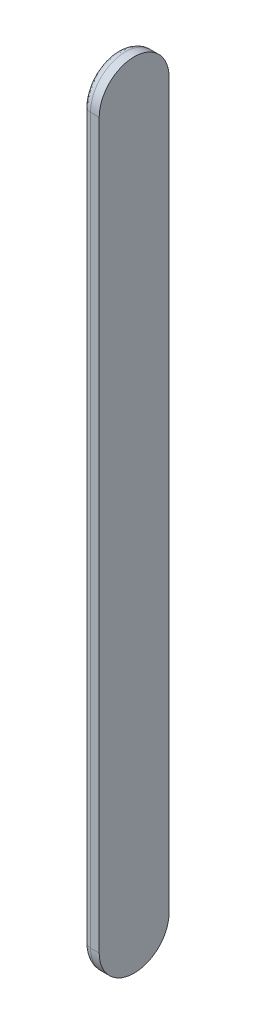
ISO-10303-21;
HEADER;
FILE_DESCRIPTION(('STEP AP214'),'2;1');
FILE_NAME('part.step','',(''),(''),'','','');
FILE_SCHEMA(('AUTOMOTIVE_DESIGN { 1 0 10303 214 1 1 1 1 }'));
ENDSEC;
DATA;
#1=APPLICATION_CONTEXT('core data for automotive mechanical design processes');
#2=APPLICATION_PROTOCOL_DEFINITION('international standard','automotive_design',2000,#1);
#3=PRODUCT_CONTEXT('',#1,'mechanical');
#4=PRODUCT('Part','Part','',(#3));
#5=PRODUCT_RELATED_PRODUCT_CATEGORY('part','',(#4));
#6=PRODUCT_DEFINITION_FORMATION('','',#4);
#7=PRODUCT_DEFINITION_CONTEXT('part definition',#1,'design');
#8=PRODUCT_DEFINITION('design','',#6,#7);
#9=PRODUCT_DEFINITION_SHAPE('','',#8);
#10=(LENGTH_UNIT() NAMED_UNIT(*) SI_UNIT(.MILLI.,.METRE.));
#11=(NAMED_UNIT(*) PLANE_ANGLE_UNIT() SI_UNIT($,.RADIAN.));
#12=(NAMED_UNIT(*) SI_UNIT($,.STERADIAN.) SOLID_ANGLE_UNIT());
#13=UNCERTAINTY_MEASURE_WITH_UNIT(LENGTH_MEASURE(1.E-05),#10,'distance_accuracy_value','');
#14=(GEOMETRIC_REPRESENTATION_CONTEXT(3) GLOBAL_UNCERTAINTY_ASSIGNED_CONTEXT((#13)) GLOBAL_UNIT_ASSIGNED_CONTEXT((#10,
#11,#12)) REPRESENTATION_CONTEXT('',''));
#15=CARTESIAN_POINT('',(0.,0.,0.));
#16=DIRECTION('',(0.,0.,1.));
#17=DIRECTION('',(1.,0.,0.));
#18=AXIS2_PLACEMENT_3D('',#15,#16,#17);
#19=CARTESIAN_POINT('',(-31.778294457,-27.2093483244,-106.5109099648));
#20=CARTESIAN_POINT('',(-31.778294457,-28.6996853488,-106.5109099648));
#21=CARTESIAN_POINT('',(-31.778294457,-28.6996853488,-105.0205729404));
#22=CARTESIAN_POINT('',(-31.778294457,-27.2093483244,-105.0205729404));
#23=CARTESIAN_POINT('',(-31.7956213972,-27.2093483244,-106.6836013136));
#24=CARTESIAN_POINT('',(-31.7956213972,-29.0450680464,-106.6836013136));
#25=CARTESIAN_POINT('',(-31.7956213972,-29.0450680464,-104.8478815916));
#26=CARTESIAN_POINT('',(-31.7956213972,-27.2093483244,-104.8478815916));
#27=CARTESIAN_POINT('',(-31.6728970554,-27.2093483244,-106.80632563));
#28=CARTESIAN_POINT('',(-31.6728970554,-29.2905167046,-106.80632563));
#29=CARTESIAN_POINT('',(-31.6728970554,-29.2905167046,-104.7251572498));
#30=CARTESIAN_POINT('',(-31.6728970554,-27.2093483244,-104.7251572498));
#31=CARTESIAN_POINT('',(-31.500205732,-27.2093483244,-106.7889987152));
#32=CARTESIAN_POINT('',(-31.500205732,-29.2558628496,-106.7889987152));
#33=CARTESIAN_POINT('',(-31.500205732,-29.2558628496,-104.74248419));
#34=CARTESIAN_POINT('',(-31.500205732,-27.2093483244,-104.74248419));
#35=(BOUNDED_SURFACE() B_SPLINE_SURFACE(3,3,((#19,#20,#21,#22),(#23,#24,#25,#26),(#27,#28,#29,
#30),(#31,#32,#33,#34)),.UNSPECIFIED.,.F.,.F.,.F.) B_SPLINE_SURFACE_WITH_KNOTS((4,4),(4,4),(0.,
1.),(0.,1.),.UNSPECIFIED.) GEOMETRIC_REPRESENTATION_ITEM() RATIONAL_B_SPLINE_SURFACE(((1.,
0.333333333333333,0.333333333333333,1.),(0.755320871117987,0.251773623705996,0.251773623705996,
0.755320871117987),(0.755320871117987,0.251773623705996,0.251773623705996,0.755320871117987),
(1.,0.333333333333333,0.333333333333333,1.))) REPRESENTATION_ITEM('') SURFACE());
#36=CARTESIAN_POINT('',(-31.5255634156,-27.2093483244,-104.9952152314));
#37=DIRECTION('',(0.,-1.,0.));
#38=DIRECTION('',(0.,0.,-1.));
#39=AXIS2_PLACEMENT_3D('',#36,#37,#38);
#40=CIRCLE('',#39,0.25399999999999);
#41=CARTESIAN_POINT('',(-31.525563415626,-27.2093483245051,-104.74121523775));
#42=VERTEX_POINT('',#41);
#43=CARTESIAN_POINT('',(-31.779563411811,-27.2093483269592,-104.995215236454));
#44=VERTEX_POINT('',#43);
#45=EDGE_CURVE('E59',#42,#44,#40,.T.);
#46=CARTESIAN_POINT('',(-31.7795634004439,-27.2093483244,-104.995215251712));
#47=CARTESIAN_POINT('',(-31.7795634004439,-28.7504007259515,-104.995215251712));
#48=CARTESIAN_POINT('',(-31.7795634004439,-28.7504007259515,-106.536267653263));
#49=CARTESIAN_POINT('',(-31.7795634004439,-27.2093483244,-106.536267653263));
#50=(BOUNDED_CURVE() B_SPLINE_CURVE(3,(#46,#47,#48,#49),.UNSPECIFIED.,.F.,
.F.) B_SPLINE_CURVE_WITH_KNOTS((4,4),(0.,1.),
.UNSPECIFIED.) CURVE() GEOMETRIC_REPRESENTATION_ITEM() RATIONAL_B_SPLINE_CURVE((0.95657830216595,
0.318859434055316,0.318859434055316,0.95657830216595)) REPRESENTATION_ITEM(''));
#51=CARTESIAN_POINT('',(-31.779563411811,-27.2093483269592,-106.53626764964));
#52=VERTEX_POINT('',#51);
#53=EDGE_CURVE('E92',#52,#44,#50,.F.);
#54=CARTESIAN_POINT('',(-31.5255634156,-27.2093483244,-106.5362676484));
#55=DIRECTION('',(0.,1.,0.));
#56=DIRECTION('',(0.,0.,1.));
#57=AXIS2_PLACEMENT_3D('',#54,#55,#56);
#58=CIRCLE('',#57,0.25399999999999);
#59=CARTESIAN_POINT('',(-31.525563415626,-27.209348324492,-106.7902676484));
#60=VERTEX_POINT('',#59);
#61=EDGE_CURVE('E86',#52,#60,#58,.F.);
#62=CARTESIAN_POINT('',(-31.5255634156,-27.2093483244,-105.7657414526));
#63=DIRECTION('',(1.,0.,0.));
#64=DIRECTION('',(0.,0.,-1.));
#65=AXIS2_PLACEMENT_3D('',#62,#63,#64);
#66=CIRCLE('',#65,1.02452619580004);
#67=EDGE_CURVE('E89',#60,#42,#66,.F.);
#68=ORIENTED_EDGE('',*,*,#45,.T.);
#69=ORIENTED_EDGE('',*,*,#53,.F.);
#70=ORIENTED_EDGE('',*,*,#61,.T.);
#71=ORIENTED_EDGE('',*,*,#67,.T.);
#72=EDGE_LOOP('',(#68,#69,#70,#71));
#73=FACE_BOUND('',#72,.T.);
#74=ADVANCED_FACE('F17',(#73),#35,.T.);
#75=CARTESIAN_POINT('',(-31.5255634156,-5.987019776,-104.9952152314));
#76=DIRECTION('',(0.,-1.,0.));
#77=DIRECTION('',(1.,0.,0.));
#78=AXIS2_PLACEMENT_3D('',#75,#76,#77);
#79=CYLINDRICAL_SURFACE('',#78,0.25399999999999);
#80=DIRECTION('',(0.,1.,0.));
#81=VECTOR('',#80,1.);
#82=CARTESIAN_POINT('',(-31.5255634156,-16.5981840502,-104.7412152314));
#83=LINE('',#82,#81);
#84=CARTESIAN_POINT('',(-31.525563415626,-5.987019776,-104.74121523775));
#85=VERTEX_POINT('',#84);
#86=EDGE_CURVE('E111',#42,#85,#83,.T.);
#87=ORIENTED_EDGE('',*,*,#86,.T.);
#88=CARTESIAN_POINT('',(-31.5255634156,-5.987019776,-104.9952152314));
#89=DIRECTION('',(0.,-1.,0.));
#90=DIRECTION('',(0.,0.,-1.));
#91=AXIS2_PLACEMENT_3D('',#88,#89,#90);
#92=CIRCLE('',#91,0.25399999999999);
#93=CARTESIAN_POINT('',(-31.779563411811,-5.98701977344083,-104.995215236454));
#94=VERTEX_POINT('',#93);
#95=EDGE_CURVE('E72',#94,#85,#92,.F.);
#96=ORIENTED_EDGE('',*,*,#95,.F.);
#97=DIRECTION('',(0.,1.,0.));
#98=VECTOR('',#97,1.);
#99=CARTESIAN_POINT('',(-31.7795634156,-16.5981840502,-104.9952152314));
#100=LINE('',#99,#98);
#101=EDGE_CURVE('E159',#44,#94,#100,.T.);
#102=ORIENTED_EDGE('',*,*,#101,.F.);
#103=ORIENTED_EDGE('',*,*,#45,.F.);
#104=EDGE_LOOP('',(#87,#96,#102,#103));
#105=FACE_BOUND('',#104,.T.);
#106=ADVANCED_FACE('F191',(#105),#79,.T.);
#107=CARTESIAN_POINT('',(-31.5255634156,-27.2093483244,-106.5362676484));
#108=DIRECTION('',(0.,1.,0.));
#109=DIRECTION('',(-1.,0.,0.));
#110=AXIS2_PLACEMENT_3D('',#107,#108,#109);
#111=CYLINDRICAL_SURFACE('',#110,0.25399999999999);
#112=DIRECTION('',(0.,-1.,0.));
#113=VECTOR('',#112,1.);
#114=CARTESIAN_POINT('',(-31.5255634156,-16.5981840502,-106.7902676484));
#115=LINE('',#114,#113);
#116=CARTESIAN_POINT('',(-31.525563415626,-5.987019776,-106.7902676484));
#117=VERTEX_POINT('',#116);
#118=EDGE_CURVE('E98',#117,#60,#115,.T.);
#119=ORIENTED_EDGE('',*,*,#118,.T.);
#120=ORIENTED_EDGE('',*,*,#61,.F.);
#121=DIRECTION('',(0.,-1.,0.));
#122=VECTOR('',#121,1.);
#123=CARTESIAN_POINT('',(-31.7795634156,-16.5981840502,-106.5362676484));
#124=LINE('',#123,#122);
#125=CARTESIAN_POINT('',(-31.779563411811,-5.98701977344083,-106.53626764964));
#126=VERTEX_POINT('',#125);
#127=EDGE_CURVE('E157',#126,#52,#124,.T.);
#128=ORIENTED_EDGE('',*,*,#127,.F.);
#129=CARTESIAN_POINT('',(-31.5255634156,-5.987019776,-106.5362676484));
#130=DIRECTION('',(0.,1.,0.));
#131=DIRECTION('',(0.,0.,1.));
#132=AXIS2_PLACEMENT_3D('',#129,#130,#131);
#133=CIRCLE('',#132,0.25399999999999);
#134=EDGE_CURVE('E79',#117,#126,#133,.T.);
#135=ORIENTED_EDGE('',*,*,#134,.F.);
#136=EDGE_LOOP('',(#119,#120,#128,#135));
#137=FACE_BOUND('',#136,.T.);
#138=ADVANCED_FACE('F99',(#137),#111,.T.);
#139=CARTESIAN_POINT('',(-31.5255634156,-27.2093483244,-106.7902676484));
#140=DIRECTION('',(0.,0.,1.));
#141=DIRECTION('',(1.,0.,0.));
#142=AXIS2_PLACEMENT_3D('',#139,#140,#141);
#143=PLANE('',#142);
#144=ORIENTED_EDGE('',*,*,#118,.F.);
#145=DIRECTION('',(-1.,0.,0.));
#146=VECTOR('',#145,1.);
#147=CARTESIAN_POINT('',(-31.3985634156,-5.987019776,-106.7902676484));
#148=LINE('',#147,#146);
#149=CARTESIAN_POINT('',(-31.2715634156,-5.987019776,-106.7902676484));
#150=VERTEX_POINT('',#149);
#151=EDGE_CURVE('E101',#150,#117,#148,.T.);
#152=ORIENTED_EDGE('',*,*,#151,.F.);
#153=DIRECTION('',(0.,-1.,0.));
#154=VECTOR('',#153,1.);
#155=CARTESIAN_POINT('',(-31.2715634156,-16.5981840502,-106.7902676484));
#156=LINE('',#155,#154);
#157=CARTESIAN_POINT('',(-31.2715634156,-27.209348324492,-106.7902676484));
#158=VERTEX_POINT('',#157);
#159=EDGE_CURVE('E48',#150,#158,#156,.T.);
#160=ORIENTED_EDGE('',*,*,#159,.T.);
#161=DIRECTION('',(1.,0.,0.));
#162=VECTOR('',#161,1.);
#163=CARTESIAN_POINT('',(-31.3985634156,-27.209348324584,-106.7902676484));
#164=LINE('',#163,#162);
#165=EDGE_CURVE('E100',#158,#60,#164,.F.);
#166=ORIENTED_EDGE('',*,*,#165,.T.);
#167=EDGE_LOOP('',(#144,#152,#160,#166));
#168=FACE_BOUND('',#167,.T.);
#169=ADVANCED_FACE('F103',(#168),#143,.F.);
#170=CARTESIAN_POINT('',(-31.5255634156,-27.2093483244,-105.7657414526));
#171=DIRECTION('',(1.,0.,0.));
#172=DIRECTION('',(0.,0.,-1.));
#173=AXIS2_PLACEMENT_3D('',#170,#171,#172);
#174=CYLINDRICAL_SURFACE('',#173,1.02452619580004);
#175=ORIENTED_EDGE('',*,*,#67,.F.);
#176=ORIENTED_EDGE('',*,*,#165,.F.);
#177=CARTESIAN_POINT('',(-31.2715634156,-27.2093483244,-105.7657414526));
#178=DIRECTION('',(1.,0.,0.));
#179=DIRECTION('',(0.,0.,-1.));
#180=AXIS2_PLACEMENT_3D('',#177,#178,#179);
#181=CIRCLE('',#180,1.02452619580004);
#182=CARTESIAN_POINT('',(-31.2715634156,-27.2093483244,-104.7412152314));
#183=VERTEX_POINT('',#182);
#184=EDGE_CURVE('E21',#158,#183,#181,.F.);
#185=ORIENTED_EDGE('',*,*,#184,.T.);
#186=DIRECTION('',(-1.,0.,0.));
#187=VECTOR('',#186,1.);
#188=CARTESIAN_POINT('',(-31.3985634156,-27.2093483244,-104.7412152314));
#189=LINE('',#188,#187);
#190=EDGE_CURVE('E109',#183,#42,#189,.T.);
#191=ORIENTED_EDGE('',*,*,#190,.T.);
#192=EDGE_LOOP('',(#175,#176,#185,#191));
#193=FACE_BOUND('',#192,.T.);
#194=ADVANCED_FACE('F107',(#193),#174,.T.);
#195=CARTESIAN_POINT('',(-31.2715634156,-27.2093483244,-104.7412152314));
#196=DIRECTION('',(0.,0.,-1.));
#197=DIRECTION('',(-1.,0.,0.));
#198=AXIS2_PLACEMENT_3D('',#195,#196,#197);
#199=PLANE('',#198);
#200=ORIENTED_EDGE('',*,*,#86,.F.);
#201=ORIENTED_EDGE('',*,*,#190,.F.);
#202=DIRECTION('',(0.,1.,0.));
#203=VECTOR('',#202,1.);
#204=CARTESIAN_POINT('',(-31.2715634156,-16.5981840502,-104.7412152314));
#205=LINE('',#204,#203);
#206=CARTESIAN_POINT('',(-31.2715634156,-5.987019776,-104.7412152314));
#207=VERTEX_POINT('',#206);
#208=EDGE_CURVE('E151',#183,#207,#205,.T.);
#209=ORIENTED_EDGE('',*,*,#208,.T.);
#210=DIRECTION('',(1.,0.,0.));
#211=VECTOR('',#210,1.);
#212=CARTESIAN_POINT('',(-31.3985634156,-5.987019776,-104.7412152314));
#213=LINE('',#212,#211);
#214=EDGE_CURVE('E36',#85,#207,#213,.T.);
#215=ORIENTED_EDGE('',*,*,#214,.F.);
#216=EDGE_LOOP('',(#200,#201,#209,#215));
#217=FACE_BOUND('',#216,.T.);
#218=ADVANCED_FACE('F138',(#217),#199,.F.);
#219=CARTESIAN_POINT('',(-31.7795634156,-28.116454816,-106.5362676484));
#220=DIRECTION('',(-1.,0.,0.));
#221=DIRECTION('',(0.,0.,1.));
#222=AXIS2_PLACEMENT_3D('',#219,#220,#221);
#223=PLANE('',#222);
#224=CARTESIAN_POINT('',(-31.7795634004439,-5.987019776,-106.536267653263));
#225=CARTESIAN_POINT('',(-31.7795634004439,-4.44596737444856,-106.536267653263));
#226=CARTESIAN_POINT('',(-31.7795634004439,-4.44596737444856,-104.995215251712));
#227=CARTESIAN_POINT('',(-31.7795634004439,-5.987019776,-104.995215251712));
#228=(BOUNDED_CURVE() B_SPLINE_CURVE(3,(#224,#225,#226,#227),.UNSPECIFIED.,.F.,
.F.) B_SPLINE_CURVE_WITH_KNOTS((4,4),(0.,1.),
.UNSPECIFIED.) CURVE() GEOMETRIC_REPRESENTATION_ITEM() RATIONAL_B_SPLINE_CURVE((0.956578302165983,
0.318859434055327,0.318859434055327,0.956578302165983)) REPRESENTATION_ITEM(''));
#229=EDGE_CURVE('E124',#126,#94,#228,.T.);
#230=ORIENTED_EDGE('',*,*,#229,.F.);
#231=ORIENTED_EDGE('',*,*,#127,.T.);
#232=ORIENTED_EDGE('',*,*,#53,.T.);
#233=ORIENTED_EDGE('',*,*,#101,.T.);
#234=EDGE_LOOP('',(#230,#231,#232,#233));
#235=FACE_BOUND('',#234,.T.);
#236=ADVANCED_FACE('F129',(#235),#223,.T.);
#237=CARTESIAN_POINT('',(-31.2715634156,-28.373502816,-106.7902676484));
#238=DIRECTION('',(-1.,0.,0.));
#239=DIRECTION('',(0.,0.,1.));
#240=AXIS2_PLACEMENT_3D('',#237,#238,#239);
#241=PLANE('',#240);
#242=ORIENTED_EDGE('',*,*,#208,.F.);
#243=ORIENTED_EDGE('',*,*,#184,.F.);
#244=ORIENTED_EDGE('',*,*,#159,.F.);
#245=CARTESIAN_POINT('',(-31.2715634156,-5.987019776,-105.7657414526));
#246=DIRECTION('',(1.,0.,0.));
#247=DIRECTION('',(0.,0.,-1.));
#248=AXIS2_PLACEMENT_3D('',#245,#246,#247);
#249=CIRCLE('',#248,1.02452619580004);
#250=EDGE_CURVE('E27',#150,#207,#249,.T.);
#251=ORIENTED_EDGE('',*,*,#250,.T.);
#252=EDGE_LOOP('',(#242,#243,#244,#251));
#253=FACE_BOUND('',#252,.T.);
#254=ADVANCED_FACE('F19',(#253),#241,.F.);
#255=CARTESIAN_POINT('',(-31.778294457,-5.987019776,-105.0205729404));
#256=CARTESIAN_POINT('',(-31.778294457,-4.4966827516,-105.0205729404));
#257=CARTESIAN_POINT('',(-31.778294457,-4.4966827516,-106.5109099648));
#258=CARTESIAN_POINT('',(-31.778294457,-5.987019776,-106.5109099648));
#259=CARTESIAN_POINT('',(-31.7956213972,-5.987019776,-104.8478815916));
#260=CARTESIAN_POINT('',(-31.7956213972,-4.151300054,-104.8478815916));
#261=CARTESIAN_POINT('',(-31.7956213972,-4.151300054,-106.6836013136));
#262=CARTESIAN_POINT('',(-31.7956213972,-5.987019776,-106.6836013136));
#263=CARTESIAN_POINT('',(-31.6728970554,-5.987019776,-104.7251572498));
#264=CARTESIAN_POINT('',(-31.6728970554,-3.9058513958,-104.7251572498));
#265=CARTESIAN_POINT('',(-31.6728970554,-3.9058513958,-106.80632563));
#266=CARTESIAN_POINT('',(-31.6728970554,-5.987019776,-106.80632563));
#267=CARTESIAN_POINT('',(-31.500205732,-5.987019776,-104.74248419));
#268=CARTESIAN_POINT('',(-31.500205732,-3.9405052508,-104.74248419));
#269=CARTESIAN_POINT('',(-31.500205732,-3.9405052508,-106.7889987152));
#270=CARTESIAN_POINT('',(-31.500205732,-5.987019776,-106.7889987152));
#271=(BOUNDED_SURFACE() B_SPLINE_SURFACE(3,3,((#255,#256,#257,#258),(#259,#260,#261,#262),(#263,
#264,#265,#266),(#267,#268,#269,#270)),.UNSPECIFIED.,.F.,.F.,
.F.) B_SPLINE_SURFACE_WITH_KNOTS((4,4),(4,4),(0.,1.),(0.,1.),
.UNSPECIFIED.) GEOMETRIC_REPRESENTATION_ITEM() RATIONAL_B_SPLINE_SURFACE(((1.,0.333333333333333,
0.333333333333333,1.),(0.755320871117987,0.251773623705996,0.251773623705996,0.755320871117987),
(0.755320871117987,0.251773623705996,0.251773623705996,0.755320871117987),(1.,0.333333333333333,
0.333333333333333,1.))) REPRESENTATION_ITEM('') SURFACE());
#272=CARTESIAN_POINT('',(-31.5255634156,-5.987019776,-105.7657414526));
#273=DIRECTION('',(1.,0.,0.));
#274=DIRECTION('',(0.,0.,-1.));
#275=AXIS2_PLACEMENT_3D('',#272,#273,#274);
#276=CIRCLE('',#275,1.02452619580004);
#277=EDGE_CURVE('E11',#85,#117,#276,.F.);
#278=ORIENTED_EDGE('',*,*,#95,.T.);
#279=ORIENTED_EDGE('',*,*,#277,.T.);
#280=ORIENTED_EDGE('',*,*,#134,.T.);
#281=ORIENTED_EDGE('',*,*,#229,.T.);
#282=EDGE_LOOP('',(#278,#279,#280,#281));
#283=FACE_BOUND('',#282,.T.);
#284=ADVANCED_FACE('F169',(#283),#271,.T.);
#285=CARTESIAN_POINT('',(-31.5255634156,-5.987019776,-105.7657414526));
#286=DIRECTION('',(1.,0.,0.));
#287=DIRECTION('',(0.,0.,-1.));
#288=AXIS2_PLACEMENT_3D('',#285,#286,#287);
#289=CYLINDRICAL_SURFACE('',#288,1.02452619580004);
#290=ORIENTED_EDGE('',*,*,#277,.F.);
#291=ORIENTED_EDGE('',*,*,#214,.T.);
#292=ORIENTED_EDGE('',*,*,#250,.F.);
#293=ORIENTED_EDGE('',*,*,#151,.T.);
#294=EDGE_LOOP('',(#290,#291,#292,#293));
#295=FACE_BOUND('',#294,.T.);
#296=ADVANCED_FACE('F181',(#295),#289,.T.);
#297=CLOSED_SHELL('',(#74,#106,#138,#169,#194,#218,#236,#254,#284,#296));
#298=MANIFOLD_SOLID_BREP('B1',#297);
#299=ADVANCED_BREP_SHAPE_REPRESENTATION('',(#18,#298),#14);
#300=SHAPE_DEFINITION_REPRESENTATION(#9,#299);
ENDSEC;
END-ISO-10303-21;
